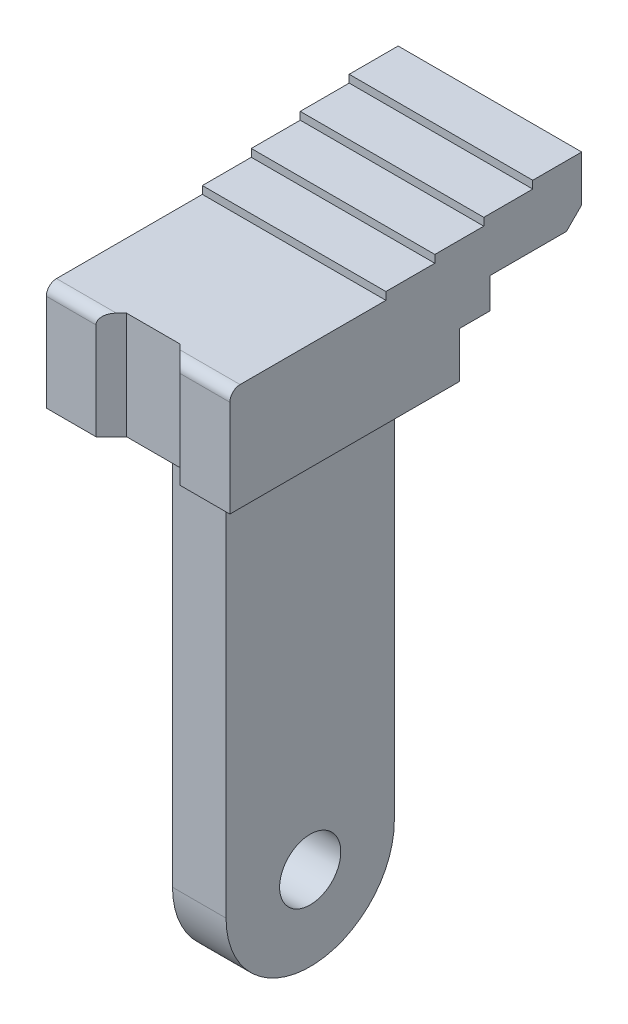
ISO-10303-21;
HEADER;
FILE_DESCRIPTION(('STEP AP214'),'2;1');
FILE_NAME('part.step','',(''),(''),'','','');
FILE_SCHEMA(('AUTOMOTIVE_DESIGN { 1 0 10303 214 1 1 1 1 }'));
ENDSEC;
DATA;
#1=APPLICATION_CONTEXT('core data for automotive mechanical design processes');
#2=APPLICATION_PROTOCOL_DEFINITION('international standard','automotive_design',2000,#1);
#3=PRODUCT_CONTEXT('',#1,'mechanical');
#4=PRODUCT('Part','Part','',(#3));
#5=PRODUCT_RELATED_PRODUCT_CATEGORY('part','',(#4));
#6=PRODUCT_DEFINITION_FORMATION('','',#4);
#7=PRODUCT_DEFINITION_CONTEXT('part definition',#1,'design');
#8=PRODUCT_DEFINITION('design','',#6,#7);
#9=PRODUCT_DEFINITION_SHAPE('','',#8);
#10=(LENGTH_UNIT() NAMED_UNIT(*) SI_UNIT(.MILLI.,.METRE.));
#11=(NAMED_UNIT(*) PLANE_ANGLE_UNIT() SI_UNIT($,.RADIAN.));
#12=(NAMED_UNIT(*) SI_UNIT($,.STERADIAN.) SOLID_ANGLE_UNIT());
#13=UNCERTAINTY_MEASURE_WITH_UNIT(LENGTH_MEASURE(1.E-05),#10,'distance_accuracy_value','');
#14=(GEOMETRIC_REPRESENTATION_CONTEXT(3) GLOBAL_UNCERTAINTY_ASSIGNED_CONTEXT((#13)) GLOBAL_UNIT_ASSIGNED_CONTEXT((#10,
#11,#12)) REPRESENTATION_CONTEXT('',''));
#15=CARTESIAN_POINT('',(0.,0.,0.));
#16=DIRECTION('',(0.,0.,1.));
#17=DIRECTION('',(1.,0.,0.));
#18=AXIS2_PLACEMENT_3D('',#15,#16,#17);
#19=CARTESIAN_POINT('',(3.,13.5,4.75));
#20=DIRECTION('',(0.,0.,-1.));
#21=DIRECTION('',(-1.,0.,0.));
#22=AXIS2_PLACEMENT_3D('',#19,#20,#21);
#23=PLANE('',#22);
#24=DIRECTION('',(0.,1.,0.));
#25=VECTOR('',#24,1.);
#26=CARTESIAN_POINT('',(-1.375,10.7049150281253,4.74999999999998));
#27=LINE('',#26,#25);
#28=CARTESIAN_POINT('',(-1.375,13.5,4.74999999999999));
#29=VERTEX_POINT('',#28);
#30=CARTESIAN_POINT('',(-1.375,16.6666666666667,4.74999999999999));
#31=VERTEX_POINT('',#30);
#32=EDGE_CURVE('E234',#29,#31,#27,.T.);
#33=ORIENTED_EDGE('',*,*,#32,.T.);
#34=DIRECTION('',(-1.,0.,0.));
#35=VECTOR('',#34,1.);
#36=CARTESIAN_POINT('',(3.,16.6666666666667,4.75));
#37=LINE('',#36,#35);
#38=CARTESIAN_POINT('',(-3.,16.6666666666667,4.75));
#39=VERTEX_POINT('',#38);
#40=EDGE_CURVE('E397',#31,#39,#37,.T.);
#41=ORIENTED_EDGE('',*,*,#40,.T.);
#42=DIRECTION('',(0.,-1.,0.));
#43=VECTOR('',#42,1.);
#44=CARTESIAN_POINT('',(-3.,13.5,4.75));
#45=LINE('',#44,#43);
#46=CARTESIAN_POINT('',(-3.,13.5,4.75));
#47=VERTEX_POINT('',#46);
#48=EDGE_CURVE('E340',#39,#47,#45,.T.);
#49=ORIENTED_EDGE('',*,*,#48,.T.);
#50=DIRECTION('',(-1.,0.,0.));
#51=VECTOR('',#50,1.);
#52=CARTESIAN_POINT('',(3.,13.5,4.75));
#53=LINE('',#52,#51);
#54=EDGE_CURVE('E348',#29,#47,#53,.T.);
#55=ORIENTED_EDGE('',*,*,#54,.F.);
#56=EDGE_LOOP('',(#33,#41,#49,#55));
#57=FACE_BOUND('',#56,.T.);
#58=ADVANCED_FACE('F32',(#57),#23,.F.);
#59=CARTESIAN_POINT('',(3.,0.,0.));
#60=DIRECTION('',(1.,0.,0.));
#61=DIRECTION('',(0.,0.,-1.));
#62=AXIS2_PLACEMENT_3D('',#59,#60,#61);
#63=PLANE('',#62);
#64=DIRECTION('',(0.,0.,1.));
#65=VECTOR('',#64,1.);
#66=CARTESIAN_POINT('',(3.,17.,4.75));
#67=LINE('',#66,#65);
#68=CARTESIAN_POINT('',(3.,17.,-0.349999999999995));
#69=VERTEX_POINT('',#68);
#70=CARTESIAN_POINT('',(3.,17.,4.41666666666667));
#71=VERTEX_POINT('',#70);
#72=EDGE_CURVE('E304',#69,#71,#67,.T.);
#73=ORIENTED_EDGE('',*,*,#72,.T.);
#74=CARTESIAN_POINT('',(3.,16.6666666666667,4.41666666666667));
#75=DIRECTION('',(1.,0.,0.));
#76=DIRECTION('',(0.,0.,-1.));
#77=AXIS2_PLACEMENT_3D('',#74,#75,#76);
#78=CIRCLE('',#77,0.333333333333333);
#79=CARTESIAN_POINT('',(3.,16.6666666666667,4.75));
#80=VERTEX_POINT('',#79);
#81=EDGE_CURVE('E11',#71,#80,#78,.T.);
#82=ORIENTED_EDGE('',*,*,#81,.T.);
#83=DIRECTION('',(0.,-1.,0.));
#84=VECTOR('',#83,1.);
#85=CARTESIAN_POINT('',(3.,13.5,4.75));
#86=LINE('',#85,#84);
#87=CARTESIAN_POINT('',(3.,13.5,4.75));
#88=VERTEX_POINT('',#87);
#89=EDGE_CURVE('E306',#80,#88,#86,.T.);
#90=ORIENTED_EDGE('',*,*,#89,.T.);
#91=DIRECTION('',(0.,0.,-1.));
#92=VECTOR('',#91,1.);
#93=CARTESIAN_POINT('',(3.,13.5,2.75));
#94=LINE('',#93,#92);
#95=CARTESIAN_POINT('',(3.,13.5,-2.75));
#96=VERTEX_POINT('',#95);
#97=EDGE_CURVE('E308',#88,#96,#94,.T.);
#98=ORIENTED_EDGE('',*,*,#97,.T.);
#99=DIRECTION('',(0.,1.,0.));
#100=VECTOR('',#99,1.);
#101=CARTESIAN_POINT('',(3.,0.,-2.75));
#102=LINE('',#101,#100);
#103=CARTESIAN_POINT('',(3.,15.,-2.75));
#104=VERTEX_POINT('',#103);
#105=EDGE_CURVE('E275',#96,#104,#102,.T.);
#106=ORIENTED_EDGE('',*,*,#105,.T.);
#107=DIRECTION('',(0.,0.,-1.));
#108=VECTOR('',#107,1.);
#109=CARTESIAN_POINT('',(3.,15.,-2.75));
#110=LINE('',#109,#108);
#111=CARTESIAN_POINT('',(3.,15.,-3.75));
#112=VERTEX_POINT('',#111);
#113=EDGE_CURVE('E277',#104,#112,#110,.T.);
#114=ORIENTED_EDGE('',*,*,#113,.T.);
#115=DIRECTION('',(0.,1.,0.));
#116=VECTOR('',#115,1.);
#117=CARTESIAN_POINT('',(3.,15.,-3.75));
#118=LINE('',#117,#116);
#119=CARTESIAN_POINT('',(3.,16.,-3.75));
#120=VERTEX_POINT('',#119);
#121=EDGE_CURVE('E280',#112,#120,#118,.T.);
#122=ORIENTED_EDGE('',*,*,#121,.T.);
#123=DIRECTION('',(0.,0.,-1.));
#124=VECTOR('',#123,1.);
#125=CARTESIAN_POINT('',(3.,16.,-3.75));
#126=LINE('',#125,#124);
#127=CARTESIAN_POINT('',(3.,16.,-6.25000000000001));
#128=VERTEX_POINT('',#127);
#129=EDGE_CURVE('E282',#120,#128,#126,.T.);
#130=ORIENTED_EDGE('',*,*,#129,.T.);
#131=DIRECTION('',(0.,0.707106781186547,-0.707106781186547));
#132=VECTOR('',#131,1.);
#133=CARTESIAN_POINT('',(3.,16.5,-6.75000000000001));
#134=LINE('',#133,#132);
#135=CARTESIAN_POINT('',(3.,16.5,-6.75000000000001));
#136=VERTEX_POINT('',#135);
#137=EDGE_CURVE('E284',#128,#136,#134,.T.);
#138=ORIENTED_EDGE('',*,*,#137,.T.);
#139=DIRECTION('',(0.,1.,0.));
#140=VECTOR('',#139,1.);
#141=CARTESIAN_POINT('',(3.,16.5,-6.75000000000001));
#142=LINE('',#141,#140);
#143=CARTESIAN_POINT('',(3.,18.,-6.75000000000001));
#144=VERTEX_POINT('',#143);
#145=EDGE_CURVE('E286',#136,#144,#142,.T.);
#146=ORIENTED_EDGE('',*,*,#145,.T.);
#147=DIRECTION('',(0.,0.,1.));
#148=VECTOR('',#147,1.);
#149=CARTESIAN_POINT('',(3.,18.,-6.75000000000001));
#150=LINE('',#149,#148);
#151=CARTESIAN_POINT('',(3.,18.,-5.15));
#152=VERTEX_POINT('',#151);
#153=EDGE_CURVE('E288',#144,#152,#150,.T.);
#154=ORIENTED_EDGE('',*,*,#153,.T.);
#155=DIRECTION('',(0.,-1.,0.));
#156=VECTOR('',#155,1.);
#157=CARTESIAN_POINT('',(3.,18.,-5.15));
#158=LINE('',#157,#156);
#159=CARTESIAN_POINT('',(3.,17.75,-5.15));
#160=VERTEX_POINT('',#159);
#161=EDGE_CURVE('E290',#152,#160,#158,.T.);
#162=ORIENTED_EDGE('',*,*,#161,.T.);
#163=DIRECTION('',(0.,0.,1.));
#164=VECTOR('',#163,1.);
#165=CARTESIAN_POINT('',(3.,17.75,-5.15));
#166=LINE('',#165,#164);
#167=CARTESIAN_POINT('',(3.,17.75,-3.55));
#168=VERTEX_POINT('',#167);
#169=EDGE_CURVE('E292',#160,#168,#166,.T.);
#170=ORIENTED_EDGE('',*,*,#169,.T.);
#171=DIRECTION('',(0.,-1.,0.));
#172=VECTOR('',#171,1.);
#173=CARTESIAN_POINT('',(3.,17.75,-3.55));
#174=LINE('',#173,#172);
#175=CARTESIAN_POINT('',(3.,17.5,-3.55));
#176=VERTEX_POINT('',#175);
#177=EDGE_CURVE('E294',#168,#176,#174,.T.);
#178=ORIENTED_EDGE('',*,*,#177,.T.);
#179=DIRECTION('',(0.,0.,1.));
#180=VECTOR('',#179,1.);
#181=CARTESIAN_POINT('',(3.,17.5,-1.95));
#182=LINE('',#181,#180);
#183=CARTESIAN_POINT('',(3.,17.5,-1.95));
#184=VERTEX_POINT('',#183);
#185=EDGE_CURVE('E296',#176,#184,#182,.T.);
#186=ORIENTED_EDGE('',*,*,#185,.T.);
#187=DIRECTION('',(0.,-1.,0.));
#188=VECTOR('',#187,1.);
#189=CARTESIAN_POINT('',(3.,17.5,-1.95));
#190=LINE('',#189,#188);
#191=CARTESIAN_POINT('',(3.,17.25,-1.95));
#192=VERTEX_POINT('',#191);
#193=EDGE_CURVE('E298',#184,#192,#190,.T.);
#194=ORIENTED_EDGE('',*,*,#193,.T.);
#195=DIRECTION('',(0.,0.,1.));
#196=VECTOR('',#195,1.);
#197=CARTESIAN_POINT('',(3.,17.25,-0.349999999999995));
#198=LINE('',#197,#196);
#199=CARTESIAN_POINT('',(3.,17.25,-0.349999999999995));
#200=VERTEX_POINT('',#199);
#201=EDGE_CURVE('E300',#192,#200,#198,.T.);
#202=ORIENTED_EDGE('',*,*,#201,.T.);
#203=DIRECTION('',(0.,-1.,0.));
#204=VECTOR('',#203,1.);
#205=CARTESIAN_POINT('',(3.,17.25,-0.349999999999995));
#206=LINE('',#205,#204);
#207=EDGE_CURVE('E302',#200,#69,#206,.T.);
#208=ORIENTED_EDGE('',*,*,#207,.T.);
#209=EDGE_LOOP('',(#73,#82,#90,#98,#106,#114,#122,#130,#138,#146,#154,#162,#170,#178,#186,#194,
#202,#208));
#210=FACE_BOUND('',#209,.T.);
#211=ADVANCED_FACE('F460',(#210),#63,.T.);
#212=CARTESIAN_POINT('',(-3.,0.,0.));
#213=DIRECTION('',(1.,0.,0.));
#214=DIRECTION('',(0.,0.,-1.));
#215=AXIS2_PLACEMENT_3D('',#212,#213,#214);
#216=PLANE('',#215);
#217=ORIENTED_EDGE('',*,*,#48,.F.);
#218=CARTESIAN_POINT('',(-3.,16.6666666666667,4.41666666666667));
#219=DIRECTION('',(1.,0.,0.));
#220=DIRECTION('',(0.,0.,-1.));
#221=AXIS2_PLACEMENT_3D('',#218,#219,#220);
#222=CIRCLE('',#221,0.333333333333333);
#223=CARTESIAN_POINT('',(-3.,17.,4.41666666666667));
#224=VERTEX_POINT('',#223);
#225=EDGE_CURVE('E404',#39,#224,#222,.F.);
#226=ORIENTED_EDGE('',*,*,#225,.T.);
#227=DIRECTION('',(0.,0.,1.));
#228=VECTOR('',#227,1.);
#229=CARTESIAN_POINT('',(-3.,17.,4.75));
#230=LINE('',#229,#228);
#231=CARTESIAN_POINT('',(-3.,17.,-0.349999999999995));
#232=VERTEX_POINT('',#231);
#233=EDGE_CURVE('E338',#232,#224,#230,.T.);
#234=ORIENTED_EDGE('',*,*,#233,.F.);
#235=DIRECTION('',(0.,-1.,0.));
#236=VECTOR('',#235,1.);
#237=CARTESIAN_POINT('',(-3.,17.25,-0.349999999999995));
#238=LINE('',#237,#236);
#239=CARTESIAN_POINT('',(-3.,17.25,-0.349999999999995));
#240=VERTEX_POINT('',#239);
#241=EDGE_CURVE('E336',#240,#232,#238,.T.);
#242=ORIENTED_EDGE('',*,*,#241,.F.);
#243=DIRECTION('',(0.,0.,1.));
#244=VECTOR('',#243,1.);
#245=CARTESIAN_POINT('',(-3.,17.25,-0.349999999999995));
#246=LINE('',#245,#244);
#247=CARTESIAN_POINT('',(-3.,17.25,-1.95));
#248=VERTEX_POINT('',#247);
#249=EDGE_CURVE('E334',#248,#240,#246,.T.);
#250=ORIENTED_EDGE('',*,*,#249,.F.);
#251=DIRECTION('',(0.,-1.,0.));
#252=VECTOR('',#251,1.);
#253=CARTESIAN_POINT('',(-3.,17.5,-1.95));
#254=LINE('',#253,#252);
#255=CARTESIAN_POINT('',(-3.,17.5,-1.95));
#256=VERTEX_POINT('',#255);
#257=EDGE_CURVE('E332',#256,#248,#254,.T.);
#258=ORIENTED_EDGE('',*,*,#257,.F.);
#259=DIRECTION('',(0.,0.,1.));
#260=VECTOR('',#259,1.);
#261=CARTESIAN_POINT('',(-3.,17.5,-1.95));
#262=LINE('',#261,#260);
#263=CARTESIAN_POINT('',(-3.,17.5,-3.55));
#264=VERTEX_POINT('',#263);
#265=EDGE_CURVE('E330',#264,#256,#262,.T.);
#266=ORIENTED_EDGE('',*,*,#265,.F.);
#267=DIRECTION('',(0.,-1.,0.));
#268=VECTOR('',#267,1.);
#269=CARTESIAN_POINT('',(-3.,17.75,-3.55));
#270=LINE('',#269,#268);
#271=CARTESIAN_POINT('',(-3.,17.75,-3.55));
#272=VERTEX_POINT('',#271);
#273=EDGE_CURVE('E328',#272,#264,#270,.T.);
#274=ORIENTED_EDGE('',*,*,#273,.F.);
#275=DIRECTION('',(0.,0.,1.));
#276=VECTOR('',#275,1.);
#277=CARTESIAN_POINT('',(-3.,17.75,-5.15));
#278=LINE('',#277,#276);
#279=CARTESIAN_POINT('',(-3.,17.75,-5.15));
#280=VERTEX_POINT('',#279);
#281=EDGE_CURVE('E326',#280,#272,#278,.T.);
#282=ORIENTED_EDGE('',*,*,#281,.F.);
#283=DIRECTION('',(0.,-1.,0.));
#284=VECTOR('',#283,1.);
#285=CARTESIAN_POINT('',(-3.,18.,-5.15));
#286=LINE('',#285,#284);
#287=CARTESIAN_POINT('',(-3.,18.,-5.15));
#288=VERTEX_POINT('',#287);
#289=EDGE_CURVE('E324',#288,#280,#286,.T.);
#290=ORIENTED_EDGE('',*,*,#289,.F.);
#291=DIRECTION('',(0.,0.,1.));
#292=VECTOR('',#291,1.);
#293=CARTESIAN_POINT('',(-3.,18.,-6.75000000000001));
#294=LINE('',#293,#292);
#295=CARTESIAN_POINT('',(-3.,18.,-6.75000000000001));
#296=VERTEX_POINT('',#295);
#297=EDGE_CURVE('E322',#296,#288,#294,.T.);
#298=ORIENTED_EDGE('',*,*,#297,.F.);
#299=DIRECTION('',(0.,1.,0.));
#300=VECTOR('',#299,1.);
#301=CARTESIAN_POINT('',(-3.,16.5,-6.75000000000001));
#302=LINE('',#301,#300);
#303=CARTESIAN_POINT('',(-3.,16.5,-6.75000000000001));
#304=VERTEX_POINT('',#303);
#305=EDGE_CURVE('E320',#304,#296,#302,.T.);
#306=ORIENTED_EDGE('',*,*,#305,.F.);
#307=DIRECTION('',(0.,0.707106781186547,-0.707106781186547));
#308=VECTOR('',#307,1.);
#309=CARTESIAN_POINT('',(-3.,16.5,-6.75000000000001));
#310=LINE('',#309,#308);
#311=CARTESIAN_POINT('',(-3.,16.,-6.25000000000001));
#312=VERTEX_POINT('',#311);
#313=EDGE_CURVE('E318',#312,#304,#310,.T.);
#314=ORIENTED_EDGE('',*,*,#313,.F.);
#315=DIRECTION('',(0.,0.,-1.));
#316=VECTOR('',#315,1.);
#317=CARTESIAN_POINT('',(-3.,16.,-3.75));
#318=LINE('',#317,#316);
#319=CARTESIAN_POINT('',(-3.,16.,-3.75));
#320=VERTEX_POINT('',#319);
#321=EDGE_CURVE('E316',#320,#312,#318,.T.);
#322=ORIENTED_EDGE('',*,*,#321,.F.);
#323=DIRECTION('',(0.,1.,0.));
#324=VECTOR('',#323,1.);
#325=CARTESIAN_POINT('',(-3.,15.,-3.75));
#326=LINE('',#325,#324);
#327=CARTESIAN_POINT('',(-3.,15.,-3.75));
#328=VERTEX_POINT('',#327);
#329=EDGE_CURVE('E314',#328,#320,#326,.T.);
#330=ORIENTED_EDGE('',*,*,#329,.F.);
#331=DIRECTION('',(0.,0.,-1.));
#332=VECTOR('',#331,1.);
#333=CARTESIAN_POINT('',(-3.,15.,-2.75));
#334=LINE('',#333,#332);
#335=CARTESIAN_POINT('',(-3.,15.,-2.75));
#336=VERTEX_POINT('',#335);
#337=EDGE_CURVE('E312',#336,#328,#334,.T.);
#338=ORIENTED_EDGE('',*,*,#337,.F.);
#339=DIRECTION('',(0.,1.,0.));
#340=VECTOR('',#339,1.);
#341=CARTESIAN_POINT('',(-3.,0.,-2.75));
#342=LINE('',#341,#340);
#343=CARTESIAN_POINT('',(-3.,13.5,-2.75));
#344=VERTEX_POINT('',#343);
#345=EDGE_CURVE('E274',#344,#336,#342,.T.);
#346=ORIENTED_EDGE('',*,*,#345,.F.);
#347=DIRECTION('',(0.,0.,-1.));
#348=VECTOR('',#347,1.);
#349=CARTESIAN_POINT('',(-3.,13.5,2.75));
#350=LINE('',#349,#348);
#351=EDGE_CURVE('E278',#47,#344,#350,.T.);
#352=ORIENTED_EDGE('',*,*,#351,.F.);
#353=EDGE_LOOP('',(#217,#226,#234,#242,#250,#258,#266,#274,#282,#290,#298,#306,#314,#322,#330,
#338,#346,#352));
#354=FACE_BOUND('',#353,.T.);
#355=ADVANCED_FACE('F434',(#354),#216,.F.);
#356=CARTESIAN_POINT('',(3.,0.,0.));
#357=DIRECTION('',(-1.,0.,0.));
#358=DIRECTION('',(0.,0.,1.));
#359=AXIS2_PLACEMENT_3D('',#356,#357,#358);
#360=CYLINDRICAL_SURFACE('',#359,2.75);
#361=CARTESIAN_POINT('',(0.875,0.,0.));
#362=DIRECTION('',(-1.,0.,0.));
#363=DIRECTION('',(0.,0.,1.));
#364=AXIS2_PLACEMENT_3D('',#361,#362,#363);
#365=CIRCLE('',#364,2.75);
#366=CARTESIAN_POINT('',(0.875,0.,-2.75));
#367=VERTEX_POINT('',#366);
#368=CARTESIAN_POINT('',(0.875,0.,2.75));
#369=VERTEX_POINT('',#368);
#370=EDGE_CURVE('E263',#367,#369,#365,.T.);
#371=ORIENTED_EDGE('',*,*,#370,.T.);
#372=DIRECTION('',(-1.,0.,0.));
#373=VECTOR('',#372,1.);
#374=CARTESIAN_POINT('',(3.,0.,2.75));
#375=LINE('',#374,#373);
#376=CARTESIAN_POINT('',(-0.875,0.,2.75));
#377=VERTEX_POINT('',#376);
#378=EDGE_CURVE('E310',#369,#377,#375,.T.);
#379=ORIENTED_EDGE('',*,*,#378,.T.);
#380=CARTESIAN_POINT('',(-0.875,0.,0.));
#381=DIRECTION('',(1.,0.,0.));
#382=DIRECTION('',(0.,0.,-1.));
#383=AXIS2_PLACEMENT_3D('',#380,#381,#382);
#384=CIRCLE('',#383,2.75);
#385=CARTESIAN_POINT('',(-0.875,0.,-2.75));
#386=VERTEX_POINT('',#385);
#387=EDGE_CURVE('E253',#377,#386,#384,.T.);
#388=ORIENTED_EDGE('',*,*,#387,.T.);
#389=DIRECTION('',(-1.,0.,0.));
#390=VECTOR('',#389,1.);
#391=CARTESIAN_POINT('',(3.,0.,-2.75));
#392=LINE('',#391,#390);
#393=EDGE_CURVE('E394',#367,#386,#392,.T.);
#394=ORIENTED_EDGE('',*,*,#393,.F.);
#395=EDGE_LOOP('',(#371,#379,#388,#394));
#396=FACE_BOUND('',#395,.T.);
#397=ADVANCED_FACE('F448',(#396),#360,.T.);
#398=CARTESIAN_POINT('',(3.,0.,-2.75));
#399=DIRECTION('',(0.,0.,1.));
#400=DIRECTION('',(1.,0.,0.));
#401=AXIS2_PLACEMENT_3D('',#398,#399,#400);
#402=PLANE('',#401);
#403=DIRECTION('',(-1.,0.,0.));
#404=VECTOR('',#403,1.);
#405=CARTESIAN_POINT('',(3.,13.5,-2.75));
#406=LINE('',#405,#404);
#407=CARTESIAN_POINT('',(0.875,13.5,-2.75));
#408=VERTEX_POINT('',#407);
#409=EDGE_CURVE('E271',#96,#408,#406,.T.);
#410=ORIENTED_EDGE('',*,*,#409,.T.);
#411=DIRECTION('',(0.,-1.,0.));
#412=VECTOR('',#411,1.);
#413=CARTESIAN_POINT('',(0.875,0.,-2.75));
#414=LINE('',#413,#412);
#415=EDGE_CURVE('E265',#408,#367,#414,.T.);
#416=ORIENTED_EDGE('',*,*,#415,.T.);
#417=ORIENTED_EDGE('',*,*,#393,.T.);
#418=DIRECTION('',(0.,1.,0.));
#419=VECTOR('',#418,1.);
#420=CARTESIAN_POINT('',(-0.875,0.,-2.75));
#421=LINE('',#420,#419);
#422=CARTESIAN_POINT('',(-0.875,13.5,-2.75));
#423=VERTEX_POINT('',#422);
#424=EDGE_CURVE('E256',#386,#423,#421,.T.);
#425=ORIENTED_EDGE('',*,*,#424,.T.);
#426=DIRECTION('',(-1.,0.,0.));
#427=VECTOR('',#426,1.);
#428=CARTESIAN_POINT('',(3.,13.5,-2.75));
#429=LINE('',#428,#427);
#430=EDGE_CURVE('E268',#423,#344,#429,.T.);
#431=ORIENTED_EDGE('',*,*,#430,.T.);
#432=ORIENTED_EDGE('',*,*,#345,.T.);
#433=DIRECTION('',(-1.,0.,0.));
#434=VECTOR('',#433,1.);
#435=CARTESIAN_POINT('',(3.,15.,-2.75));
#436=LINE('',#435,#434);
#437=EDGE_CURVE('E391',#104,#336,#436,.T.);
#438=ORIENTED_EDGE('',*,*,#437,.F.);
#439=ORIENTED_EDGE('',*,*,#105,.F.);
#440=EDGE_LOOP('',(#410,#416,#417,#425,#431,#432,#438,#439));
#441=FACE_BOUND('',#440,.T.);
#442=ADVANCED_FACE('F442',(#441),#402,.F.);
#443=CARTESIAN_POINT('',(3.,15.,-2.75));
#444=DIRECTION('',(0.,1.,0.));
#445=DIRECTION('',(0.,0.,1.));
#446=AXIS2_PLACEMENT_3D('',#443,#444,#445);
#447=PLANE('',#446);
#448=ORIENTED_EDGE('',*,*,#337,.T.);
#449=DIRECTION('',(-1.,0.,0.));
#450=VECTOR('',#449,1.);
#451=CARTESIAN_POINT('',(3.,15.,-3.75));
#452=LINE('',#451,#450);
#453=EDGE_CURVE('E388',#112,#328,#452,.T.);
#454=ORIENTED_EDGE('',*,*,#453,.F.);
#455=ORIENTED_EDGE('',*,*,#113,.F.);
#456=ORIENTED_EDGE('',*,*,#437,.T.);
#457=EDGE_LOOP('',(#448,#454,#455,#456));
#458=FACE_BOUND('',#457,.T.);
#459=ADVANCED_FACE('F465',(#458),#447,.F.);
#460=CARTESIAN_POINT('',(3.,15.,-3.75));
#461=DIRECTION('',(0.,0.,1.));
#462=DIRECTION('',(1.,0.,0.));
#463=AXIS2_PLACEMENT_3D('',#460,#461,#462);
#464=PLANE('',#463);
#465=ORIENTED_EDGE('',*,*,#329,.T.);
#466=DIRECTION('',(-1.,0.,0.));
#467=VECTOR('',#466,1.);
#468=CARTESIAN_POINT('',(3.,16.,-3.75));
#469=LINE('',#468,#467);
#470=EDGE_CURVE('E385',#120,#320,#469,.T.);
#471=ORIENTED_EDGE('',*,*,#470,.F.);
#472=ORIENTED_EDGE('',*,*,#121,.F.);
#473=ORIENTED_EDGE('',*,*,#453,.T.);
#474=EDGE_LOOP('',(#465,#471,#472,#473));
#475=FACE_BOUND('',#474,.T.);
#476=ADVANCED_FACE('F468',(#475),#464,.F.);
#477=CARTESIAN_POINT('',(3.,16.,-3.75));
#478=DIRECTION('',(0.,1.,0.));
#479=DIRECTION('',(0.,0.,1.));
#480=AXIS2_PLACEMENT_3D('',#477,#478,#479);
#481=PLANE('',#480);
#482=ORIENTED_EDGE('',*,*,#321,.T.);
#483=DIRECTION('',(-1.,0.,0.));
#484=VECTOR('',#483,1.);
#485=CARTESIAN_POINT('',(3.,16.,-6.25000000000001));
#486=LINE('',#485,#484);
#487=EDGE_CURVE('E382',#128,#312,#486,.T.);
#488=ORIENTED_EDGE('',*,*,#487,.F.);
#489=ORIENTED_EDGE('',*,*,#129,.F.);
#490=ORIENTED_EDGE('',*,*,#470,.T.);
#491=EDGE_LOOP('',(#482,#488,#489,#490));
#492=FACE_BOUND('',#491,.T.);
#493=ADVANCED_FACE('F473',(#492),#481,.F.);
#494=CARTESIAN_POINT('',(3.,16.5,-6.75000000000001));
#495=DIRECTION('',(0.,0.707106781186548,0.707106781186548));
#496=DIRECTION('',(0.,-0.707106781186548,0.707106781186548));
#497=AXIS2_PLACEMENT_3D('',#494,#495,#496);
#498=PLANE('',#497);
#499=ORIENTED_EDGE('',*,*,#313,.T.);
#500=DIRECTION('',(-1.,0.,0.));
#501=VECTOR('',#500,1.);
#502=CARTESIAN_POINT('',(3.,16.5,-6.75000000000001));
#503=LINE('',#502,#501);
#504=EDGE_CURVE('E379',#136,#304,#503,.T.);
#505=ORIENTED_EDGE('',*,*,#504,.F.);
#506=ORIENTED_EDGE('',*,*,#137,.F.);
#507=ORIENTED_EDGE('',*,*,#487,.T.);
#508=EDGE_LOOP('',(#499,#505,#506,#507));
#509=FACE_BOUND('',#508,.T.);
#510=ADVANCED_FACE('F479',(#509),#498,.F.);
#511=CARTESIAN_POINT('',(3.,16.5,-6.75000000000001));
#512=DIRECTION('',(0.,0.,1.));
#513=DIRECTION('',(1.,0.,0.));
#514=AXIS2_PLACEMENT_3D('',#511,#512,#513);
#515=PLANE('',#514);
#516=ORIENTED_EDGE('',*,*,#305,.T.);
#517=DIRECTION('',(-1.,0.,0.));
#518=VECTOR('',#517,1.);
#519=CARTESIAN_POINT('',(3.,18.,-6.75000000000001));
#520=LINE('',#519,#518);
#521=EDGE_CURVE('E376',#144,#296,#520,.T.);
#522=ORIENTED_EDGE('',*,*,#521,.F.);
#523=ORIENTED_EDGE('',*,*,#145,.F.);
#524=ORIENTED_EDGE('',*,*,#504,.T.);
#525=EDGE_LOOP('',(#516,#522,#523,#524));
#526=FACE_BOUND('',#525,.T.);
#527=ADVANCED_FACE('F483',(#526),#515,.F.);
#528=CARTESIAN_POINT('',(3.,18.,-6.75000000000001));
#529=DIRECTION('',(0.,-1.,0.));
#530=DIRECTION('',(0.,0.,-1.));
#531=AXIS2_PLACEMENT_3D('',#528,#529,#530);
#532=PLANE('',#531);
#533=ORIENTED_EDGE('',*,*,#297,.T.);
#534=DIRECTION('',(-1.,0.,0.));
#535=VECTOR('',#534,1.);
#536=CARTESIAN_POINT('',(3.,18.,-5.15));
#537=LINE('',#536,#535);
#538=EDGE_CURVE('E373',#152,#288,#537,.T.);
#539=ORIENTED_EDGE('',*,*,#538,.F.);
#540=ORIENTED_EDGE('',*,*,#153,.F.);
#541=ORIENTED_EDGE('',*,*,#521,.T.);
#542=EDGE_LOOP('',(#533,#539,#540,#541));
#543=FACE_BOUND('',#542,.T.);
#544=ADVANCED_FACE('F488',(#543),#532,.F.);
#545=CARTESIAN_POINT('',(3.,18.,-5.15));
#546=DIRECTION('',(0.,0.,-1.));
#547=DIRECTION('',(-1.,0.,0.));
#548=AXIS2_PLACEMENT_3D('',#545,#546,#547);
#549=PLANE('',#548);
#550=ORIENTED_EDGE('',*,*,#289,.T.);
#551=DIRECTION('',(-1.,0.,0.));
#552=VECTOR('',#551,1.);
#553=CARTESIAN_POINT('',(3.,17.75,-5.15));
#554=LINE('',#553,#552);
#555=EDGE_CURVE('E370',#160,#280,#554,.T.);
#556=ORIENTED_EDGE('',*,*,#555,.F.);
#557=ORIENTED_EDGE('',*,*,#161,.F.);
#558=ORIENTED_EDGE('',*,*,#538,.T.);
#559=EDGE_LOOP('',(#550,#556,#557,#558));
#560=FACE_BOUND('',#559,.T.);
#561=ADVANCED_FACE('F494',(#560),#549,.F.);
#562=CARTESIAN_POINT('',(3.,17.75,-5.15));
#563=DIRECTION('',(0.,-1.,0.));
#564=DIRECTION('',(0.,0.,-1.));
#565=AXIS2_PLACEMENT_3D('',#562,#563,#564);
#566=PLANE('',#565);
#567=ORIENTED_EDGE('',*,*,#281,.T.);
#568=DIRECTION('',(-1.,0.,0.));
#569=VECTOR('',#568,1.);
#570=CARTESIAN_POINT('',(3.,17.75,-3.55));
#571=LINE('',#570,#569);
#572=EDGE_CURVE('E367',#168,#272,#571,.T.);
#573=ORIENTED_EDGE('',*,*,#572,.F.);
#574=ORIENTED_EDGE('',*,*,#169,.F.);
#575=ORIENTED_EDGE('',*,*,#555,.T.);
#576=EDGE_LOOP('',(#567,#573,#574,#575));
#577=FACE_BOUND('',#576,.T.);
#578=ADVANCED_FACE('F498',(#577),#566,.F.);
#579=CARTESIAN_POINT('',(3.,17.75,-3.55));
#580=DIRECTION('',(0.,0.,-1.));
#581=DIRECTION('',(0.,1.,0.));
#582=AXIS2_PLACEMENT_3D('',#579,#580,#581);
#583=PLANE('',#582);
#584=ORIENTED_EDGE('',*,*,#273,.T.);
#585=DIRECTION('',(-1.,0.,0.));
#586=VECTOR('',#585,1.);
#587=CARTESIAN_POINT('',(3.,17.5,-3.55));
#588=LINE('',#587,#586);
#589=EDGE_CURVE('E364',#176,#264,#588,.T.);
#590=ORIENTED_EDGE('',*,*,#589,.F.);
#591=ORIENTED_EDGE('',*,*,#177,.F.);
#592=ORIENTED_EDGE('',*,*,#572,.T.);
#593=EDGE_LOOP('',(#584,#590,#591,#592));
#594=FACE_BOUND('',#593,.T.);
#595=ADVANCED_FACE('F503',(#594),#583,.F.);
#596=CARTESIAN_POINT('',(3.,17.5,-1.95));
#597=DIRECTION('',(0.,-1.,0.));
#598=DIRECTION('',(0.,0.,-1.));
#599=AXIS2_PLACEMENT_3D('',#596,#597,#598);
#600=PLANE('',#599);
#601=ORIENTED_EDGE('',*,*,#265,.T.);
#602=DIRECTION('',(-1.,0.,0.));
#603=VECTOR('',#602,1.);
#604=CARTESIAN_POINT('',(3.,17.5,-1.95));
#605=LINE('',#604,#603);
#606=EDGE_CURVE('E361',#184,#256,#605,.T.);
#607=ORIENTED_EDGE('',*,*,#606,.F.);
#608=ORIENTED_EDGE('',*,*,#185,.F.);
#609=ORIENTED_EDGE('',*,*,#589,.T.);
#610=EDGE_LOOP('',(#601,#607,#608,#609));
#611=FACE_BOUND('',#610,.T.);
#612=ADVANCED_FACE('F509',(#611),#600,.F.);
#613=CARTESIAN_POINT('',(3.,17.5,-1.95));
#614=DIRECTION('',(0.,0.,-1.));
#615=DIRECTION('',(0.,1.,0.));
#616=AXIS2_PLACEMENT_3D('',#613,#614,#615);
#617=PLANE('',#616);
#618=ORIENTED_EDGE('',*,*,#257,.T.);
#619=DIRECTION('',(-1.,0.,0.));
#620=VECTOR('',#619,1.);
#621=CARTESIAN_POINT('',(3.,17.25,-1.95));
#622=LINE('',#621,#620);
#623=EDGE_CURVE('E358',#192,#248,#622,.T.);
#624=ORIENTED_EDGE('',*,*,#623,.F.);
#625=ORIENTED_EDGE('',*,*,#193,.F.);
#626=ORIENTED_EDGE('',*,*,#606,.T.);
#627=EDGE_LOOP('',(#618,#624,#625,#626));
#628=FACE_BOUND('',#627,.T.);
#629=ADVANCED_FACE('F513',(#628),#617,.F.);
#630=CARTESIAN_POINT('',(3.,17.25,-0.349999999999995));
#631=DIRECTION('',(0.,-1.,0.));
#632=DIRECTION('',(0.,0.,-1.));
#633=AXIS2_PLACEMENT_3D('',#630,#631,#632);
#634=PLANE('',#633);
#635=ORIENTED_EDGE('',*,*,#249,.T.);
#636=DIRECTION('',(-1.,0.,0.));
#637=VECTOR('',#636,1.);
#638=CARTESIAN_POINT('',(3.,17.25,-0.349999999999995));
#639=LINE('',#638,#637);
#640=EDGE_CURVE('E355',#200,#240,#639,.T.);
#641=ORIENTED_EDGE('',*,*,#640,.F.);
#642=ORIENTED_EDGE('',*,*,#201,.F.);
#643=ORIENTED_EDGE('',*,*,#623,.T.);
#644=EDGE_LOOP('',(#635,#641,#642,#643));
#645=FACE_BOUND('',#644,.T.);
#646=ADVANCED_FACE('F518',(#645),#634,.F.);
#647=CARTESIAN_POINT('',(3.,17.25,-0.349999999999995));
#648=DIRECTION('',(0.,0.,-1.));
#649=DIRECTION('',(-1.,0.,0.));
#650=AXIS2_PLACEMENT_3D('',#647,#648,#649);
#651=PLANE('',#650);
#652=ORIENTED_EDGE('',*,*,#241,.T.);
#653=DIRECTION('',(-1.,0.,0.));
#654=VECTOR('',#653,1.);
#655=CARTESIAN_POINT('',(3.,17.,-0.349999999999995));
#656=LINE('',#655,#654);
#657=EDGE_CURVE('E352',#69,#232,#656,.T.);
#658=ORIENTED_EDGE('',*,*,#657,.F.);
#659=ORIENTED_EDGE('',*,*,#207,.F.);
#660=ORIENTED_EDGE('',*,*,#640,.T.);
#661=EDGE_LOOP('',(#652,#658,#659,#660));
#662=FACE_BOUND('',#661,.T.);
#663=ADVANCED_FACE('F523',(#662),#651,.F.);
#664=CARTESIAN_POINT('',(3.,17.,4.75));
#665=DIRECTION('',(0.,-1.,0.));
#666=DIRECTION('',(0.,0.,-1.));
#667=AXIS2_PLACEMENT_3D('',#664,#665,#666);
#668=PLANE('',#667);
#669=ORIENTED_EDGE('',*,*,#233,.T.);
#670=DIRECTION('',(-1.,0.,0.));
#671=VECTOR('',#670,1.);
#672=CARTESIAN_POINT('',(3.,17.,4.41666666666667));
#673=LINE('',#672,#671);
#674=CARTESIAN_POINT('',(-1.04166666666668,17.,4.41666666666667));
#675=VERTEX_POINT('',#674);
#676=EDGE_CURVE('E408',#224,#675,#673,.F.);
#677=ORIENTED_EDGE('',*,*,#676,.T.);
#678=DIRECTION('',(-0.707106781186547,0.,0.707106781186548));
#679=VECTOR('',#678,1.);
#680=CARTESIAN_POINT('',(-0.875,17.,4.24999999999999));
#681=LINE('',#680,#679);
#682=CARTESIAN_POINT('',(-0.875,17.,4.24999999999999));
#683=VERTEX_POINT('',#682);
#684=EDGE_CURVE('E218',#683,#675,#681,.T.);
#685=ORIENTED_EDGE('',*,*,#684,.F.);
#686=DIRECTION('',(-1.,0.,0.));
#687=VECTOR('',#686,1.);
#688=CARTESIAN_POINT('',(-0.875,17.,4.24999999999999));
#689=LINE('',#688,#687);
#690=CARTESIAN_POINT('',(0.875,17.,4.24999999999999));
#691=VERTEX_POINT('',#690);
#692=EDGE_CURVE('E217',#691,#683,#689,.T.);
#693=ORIENTED_EDGE('',*,*,#692,.F.);
#694=DIRECTION('',(-0.707106781186547,0.,-0.707106781186548));
#695=VECTOR('',#694,1.);
#696=CARTESIAN_POINT('',(0.875,17.,4.24999999999999));
#697=LINE('',#696,#695);
#698=CARTESIAN_POINT('',(1.04166666666668,17.,4.41666666666667));
#699=VERTEX_POINT('',#698);
#700=EDGE_CURVE('E209',#699,#691,#697,.T.);
#701=ORIENTED_EDGE('',*,*,#700,.F.);
#702=DIRECTION('',(-1.,0.,0.));
#703=VECTOR('',#702,1.);
#704=CARTESIAN_POINT('',(3.,17.,4.41666666666667));
#705=LINE('',#704,#703);
#706=EDGE_CURVE('E406',#699,#71,#705,.F.);
#707=ORIENTED_EDGE('',*,*,#706,.T.);
#708=ORIENTED_EDGE('',*,*,#72,.F.);
#709=ORIENTED_EDGE('',*,*,#657,.T.);
#710=EDGE_LOOP('',(#669,#677,#685,#693,#701,#707,#708,#709));
#711=FACE_BOUND('',#710,.T.);
#712=ADVANCED_FACE('F232',(#711),#668,.F.);
#713=ORIENTED_EDGE('',*,*,#89,.F.);
#714=DIRECTION('',(-1.,0.,0.));
#715=VECTOR('',#714,1.);
#716=CARTESIAN_POINT('',(3.,16.6666666666667,4.75));
#717=LINE('',#716,#715);
#718=CARTESIAN_POINT('',(1.375,16.6666666666667,4.74999999999999));
#719=VERTEX_POINT('',#718);
#720=EDGE_CURVE('E412',#80,#719,#717,.T.);
#721=ORIENTED_EDGE('',*,*,#720,.T.);
#722=DIRECTION('',(0.,1.,0.));
#723=VECTOR('',#722,1.);
#724=CARTESIAN_POINT('',(1.375,10.7049150281253,4.74999999999998));
#725=LINE('',#724,#723);
#726=CARTESIAN_POINT('',(1.375,13.5,4.74999999999999));
#727=VERTEX_POINT('',#726);
#728=EDGE_CURVE('E229',#727,#719,#725,.T.);
#729=ORIENTED_EDGE('',*,*,#728,.F.);
#730=EDGE_CURVE('E349',#88,#727,#53,.T.);
#731=ORIENTED_EDGE('',*,*,#730,.F.);
#732=EDGE_LOOP('',(#713,#721,#729,#731));
#733=FACE_BOUND('',#732,.T.);
#734=ADVANCED_FACE('F415',(#733),#23,.F.);
#735=CARTESIAN_POINT('',(3.,13.5,2.75));
#736=DIRECTION('',(0.,1.,0.));
#737=DIRECTION('',(0.,0.,1.));
#738=AXIS2_PLACEMENT_3D('',#735,#736,#737);
#739=PLANE('',#738);
#740=DIRECTION('',(1.,0.,0.));
#741=VECTOR('',#740,1.);
#742=CARTESIAN_POINT('',(-0.875,13.5,4.24999999999999));
#743=LINE('',#742,#741);
#744=CARTESIAN_POINT('',(-0.875,13.5,4.24999999999999));
#745=VERTEX_POINT('',#744);
#746=CARTESIAN_POINT('',(0.875,13.5,4.24999999999999));
#747=VERTEX_POINT('',#746);
#748=EDGE_CURVE('E226',#745,#747,#743,.T.);
#749=ORIENTED_EDGE('',*,*,#748,.F.);
#750=DIRECTION('',(0.707106781186547,0.,-0.707106781186548));
#751=VECTOR('',#750,1.);
#752=CARTESIAN_POINT('',(-0.874999999999999,13.5,4.24999999999999));
#753=LINE('',#752,#751);
#754=EDGE_CURVE('E249',#29,#745,#753,.T.);
#755=ORIENTED_EDGE('',*,*,#754,.F.);
#756=ORIENTED_EDGE('',*,*,#54,.T.);
#757=ORIENTED_EDGE('',*,*,#351,.T.);
#758=ORIENTED_EDGE('',*,*,#430,.F.);
#759=DIRECTION('',(0.,0.,1.));
#760=VECTOR('',#759,1.);
#761=CARTESIAN_POINT('',(-0.875,13.5,-6.75000000000001));
#762=LINE('',#761,#760);
#763=CARTESIAN_POINT('',(-0.875,13.5,2.75));
#764=VERTEX_POINT('',#763);
#765=EDGE_CURVE('E246',#423,#764,#762,.T.);
#766=ORIENTED_EDGE('',*,*,#765,.T.);
#767=DIRECTION('',(-1.,0.,0.));
#768=VECTOR('',#767,1.);
#769=CARTESIAN_POINT('',(3.,13.5,2.75));
#770=LINE('',#769,#768);
#771=CARTESIAN_POINT('',(0.875,13.5,2.75));
#772=VERTEX_POINT('',#771);
#773=EDGE_CURVE('E345',#772,#764,#770,.T.);
#774=ORIENTED_EDGE('',*,*,#773,.F.);
#775=DIRECTION('',(0.,0.,1.));
#776=VECTOR('',#775,1.);
#777=CARTESIAN_POINT('',(0.875,13.5,-6.75000000000001));
#778=LINE('',#777,#776);
#779=EDGE_CURVE('E243',#408,#772,#778,.T.);
#780=ORIENTED_EDGE('',*,*,#779,.F.);
#781=ORIENTED_EDGE('',*,*,#409,.F.);
#782=ORIENTED_EDGE('',*,*,#97,.F.);
#783=ORIENTED_EDGE('',*,*,#730,.T.);
#784=DIRECTION('',(0.707106781186547,0.,0.707106781186548));
#785=VECTOR('',#784,1.);
#786=CARTESIAN_POINT('',(0.874999999999999,13.5,4.24999999999999));
#787=LINE('',#786,#785);
#788=EDGE_CURVE('E240',#747,#727,#787,.T.);
#789=ORIENTED_EDGE('',*,*,#788,.F.);
#790=EDGE_LOOP('',(#749,#755,#756,#757,#758,#766,#774,#780,#781,#782,#783,#789));
#791=FACE_BOUND('',#790,.T.);
#792=ADVANCED_FACE('F438',(#791),#739,.F.);
#793=CARTESIAN_POINT('',(3.,0.,2.75));
#794=DIRECTION('',(0.,0.,-1.));
#795=DIRECTION('',(-1.,0.,0.));
#796=AXIS2_PLACEMENT_3D('',#793,#794,#795);
#797=PLANE('',#796);
#798=ORIENTED_EDGE('',*,*,#378,.F.);
#799=DIRECTION('',(0.,1.,0.));
#800=VECTOR('',#799,1.);
#801=CARTESIAN_POINT('',(0.875,0.,2.75));
#802=LINE('',#801,#800);
#803=EDGE_CURVE('E260',#369,#772,#802,.T.);
#804=ORIENTED_EDGE('',*,*,#803,.T.);
#805=ORIENTED_EDGE('',*,*,#773,.T.);
#806=DIRECTION('',(0.,-1.,0.));
#807=VECTOR('',#806,1.);
#808=CARTESIAN_POINT('',(-0.875,0.,2.75));
#809=LINE('',#808,#807);
#810=EDGE_CURVE('E250',#764,#377,#809,.T.);
#811=ORIENTED_EDGE('',*,*,#810,.T.);
#812=EDGE_LOOP('',(#798,#804,#805,#811));
#813=FACE_BOUND('',#812,.T.);
#814=ADVANCED_FACE('F452',(#813),#797,.F.);
#815=CARTESIAN_POINT('',(-0.875,-2.75,-6.75000000000001));
#816=DIRECTION('',(1.,0.,0.));
#817=DIRECTION('',(0.,0.,-1.));
#818=AXIS2_PLACEMENT_3D('',#815,#816,#817);
#819=PLANE('',#818);
#820=CARTESIAN_POINT('',(-0.875,0.,0.));
#821=DIRECTION('',(1.,0.,0.));
#822=DIRECTION('',(0.,0.,-1.));
#823=AXIS2_PLACEMENT_3D('',#820,#821,#822);
#824=CIRCLE('',#823,1.);
#825=CARTESIAN_POINT('',(-0.875,0.,-1.));
#826=VERTEX_POINT('',#825);
#827=EDGE_CURVE('E245',#826,#826,#824,.T.);
#828=ORIENTED_EDGE('',*,*,#827,.T.);
#829=EDGE_LOOP('',(#828));
#830=FACE_BOUND('',#829,.T.);
#831=ORIENTED_EDGE('',*,*,#387,.F.);
#832=ORIENTED_EDGE('',*,*,#810,.F.);
#833=ORIENTED_EDGE('',*,*,#765,.F.);
#834=ORIENTED_EDGE('',*,*,#424,.F.);
#835=EDGE_LOOP('',(#831,#832,#833,#834));
#836=FACE_BOUND('',#835,.T.);
#837=ADVANCED_FACE('F446',(#830,#836),#819,.F.);
#838=CARTESIAN_POINT('',(0.875,-2.75,-6.75000000000001));
#839=DIRECTION('',(-1.,0.,0.));
#840=DIRECTION('',(0.,0.,1.));
#841=AXIS2_PLACEMENT_3D('',#838,#839,#840);
#842=PLANE('',#841);
#843=CARTESIAN_POINT('',(0.875,0.,0.));
#844=DIRECTION('',(-1.,0.,0.));
#845=DIRECTION('',(0.,0.,1.));
#846=AXIS2_PLACEMENT_3D('',#843,#844,#845);
#847=CIRCLE('',#846,1.);
#848=CARTESIAN_POINT('',(0.875,0.,1.));
#849=VERTEX_POINT('',#848);
#850=EDGE_CURVE('E259',#849,#849,#847,.T.);
#851=ORIENTED_EDGE('',*,*,#850,.T.);
#852=EDGE_LOOP('',(#851));
#853=FACE_BOUND('',#852,.T.);
#854=ORIENTED_EDGE('',*,*,#779,.T.);
#855=ORIENTED_EDGE('',*,*,#803,.F.);
#856=ORIENTED_EDGE('',*,*,#370,.F.);
#857=ORIENTED_EDGE('',*,*,#415,.F.);
#858=EDGE_LOOP('',(#854,#855,#856,#857));
#859=FACE_BOUND('',#858,.T.);
#860=ADVANCED_FACE('F586',(#853,#859),#842,.F.);
#861=CARTESIAN_POINT('',(3.,0.,0.));
#862=DIRECTION('',(-1.,0.,0.));
#863=DIRECTION('',(0.,0.,1.));
#864=AXIS2_PLACEMENT_3D('',#861,#862,#863);
#865=CYLINDRICAL_SURFACE('',#864,1.);
#866=ORIENTED_EDGE('',*,*,#850,.F.);
#867=EDGE_LOOP('',(#866));
#868=FACE_BOUND('',#867,.T.);
#869=ORIENTED_EDGE('',*,*,#827,.F.);
#870=EDGE_LOOP('',(#869));
#871=FACE_BOUND('',#870,.T.);
#872=ADVANCED_FACE('F592',(#868,#871),#865,.F.);
#873=CARTESIAN_POINT('',(-0.875,10.7049150281253,4.24999999999999));
#874=DIRECTION('',(-0.707106781186548,0.,-0.707106781186547));
#875=DIRECTION('',(-0.707106781186547,0.,0.707106781186548));
#876=AXIS2_PLACEMENT_3D('',#873,#874,#875);
#877=PLANE('',#876);
#878=ORIENTED_EDGE('',*,*,#684,.T.);
#879=CARTESIAN_POINT('',(-1.04166666666668,16.6666666666667,4.41666666666667));
#880=DIRECTION('',(-0.707106781186548,0.,-0.707106781186547));
#881=DIRECTION('',(-0.707106781186547,0.,0.707106781186548));
#882=AXIS2_PLACEMENT_3D('',#879,#880,#881);
#883=ELLIPSE('',#882,0.471404520791032,0.333333333333333);
#884=EDGE_CURVE('E410',#675,#31,#883,.F.);
#885=ORIENTED_EDGE('',*,*,#884,.T.);
#886=ORIENTED_EDGE('',*,*,#32,.F.);
#887=ORIENTED_EDGE('',*,*,#754,.T.);
#888=DIRECTION('',(0.,1.,0.));
#889=VECTOR('',#888,1.);
#890=CARTESIAN_POINT('',(-0.875,10.7049150281253,4.24999999999999));
#891=LINE('',#890,#889);
#892=EDGE_CURVE('E228',#745,#683,#891,.T.);
#893=ORIENTED_EDGE('',*,*,#892,.T.);
#894=EDGE_LOOP('',(#878,#885,#886,#887,#893));
#895=FACE_BOUND('',#894,.T.);
#896=ADVANCED_FACE('F423',(#895),#877,.F.);
#897=CARTESIAN_POINT('',(-0.875,10.7049150281253,4.24999999999999));
#898=DIRECTION('',(0.,0.,-1.));
#899=DIRECTION('',(0.,1.,0.));
#900=AXIS2_PLACEMENT_3D('',#897,#898,#899);
#901=PLANE('',#900);
#902=ORIENTED_EDGE('',*,*,#748,.T.);
#903=DIRECTION('',(0.,1.,0.));
#904=VECTOR('',#903,1.);
#905=CARTESIAN_POINT('',(0.875,10.7049150281253,4.24999999999999));
#906=LINE('',#905,#904);
#907=EDGE_CURVE('E213',#747,#691,#906,.T.);
#908=ORIENTED_EDGE('',*,*,#907,.T.);
#909=ORIENTED_EDGE('',*,*,#692,.T.);
#910=ORIENTED_EDGE('',*,*,#892,.F.);
#911=EDGE_LOOP('',(#902,#908,#909,#910));
#912=FACE_BOUND('',#911,.T.);
#913=ADVANCED_FACE('F222',(#912),#901,.F.);
#914=CARTESIAN_POINT('',(0.875,10.7049150281253,4.24999999999999));
#915=DIRECTION('',(0.707106781186548,0.,-0.707106781186547));
#916=DIRECTION('',(-0.707106781186547,0.,-0.707106781186548));
#917=AXIS2_PLACEMENT_3D('',#914,#915,#916);
#918=PLANE('',#917);
#919=ORIENTED_EDGE('',*,*,#728,.T.);
#920=CARTESIAN_POINT('',(1.04166666666668,16.6666666666667,4.41666666666667));
#921=DIRECTION('',(0.707106781186548,0.,-0.707106781186547));
#922=DIRECTION('',(-0.707106781186547,0.,-0.707106781186548));
#923=AXIS2_PLACEMENT_3D('',#920,#921,#922);
#924=ELLIPSE('',#923,0.471404520791032,0.333333333333333);
#925=EDGE_CURVE('E40',#719,#699,#924,.F.);
#926=ORIENTED_EDGE('',*,*,#925,.T.);
#927=ORIENTED_EDGE('',*,*,#700,.T.);
#928=ORIENTED_EDGE('',*,*,#907,.F.);
#929=ORIENTED_EDGE('',*,*,#788,.T.);
#930=EDGE_LOOP('',(#919,#926,#927,#928,#929));
#931=FACE_BOUND('',#930,.T.);
#932=ADVANCED_FACE('F212',(#931),#918,.F.);
#933=CARTESIAN_POINT('',(3.,16.6666666666667,4.41666666666667));
#934=DIRECTION('',(-1.,0.,0.));
#935=DIRECTION('',(0.,0.,1.));
#936=AXIS2_PLACEMENT_3D('',#933,#934,#935);
#937=CYLINDRICAL_SURFACE('',#936,0.333333333333333);
#938=ORIENTED_EDGE('',*,*,#884,.F.);
#939=ORIENTED_EDGE('',*,*,#676,.F.);
#940=ORIENTED_EDGE('',*,*,#225,.F.);
#941=ORIENTED_EDGE('',*,*,#40,.F.);
#942=EDGE_LOOP('',(#938,#939,#940,#941));
#943=FACE_BOUND('',#942,.T.);
#944=ADVANCED_FACE('F427',(#943),#937,.T.);
#945=CARTESIAN_POINT('',(3.,16.6666666666667,4.41666666666667));
#946=DIRECTION('',(-1.,0.,0.));
#947=DIRECTION('',(0.,0.,1.));
#948=AXIS2_PLACEMENT_3D('',#945,#946,#947);
#949=CYLINDRICAL_SURFACE('',#948,0.333333333333333);
#950=ORIENTED_EDGE('',*,*,#81,.F.);
#951=ORIENTED_EDGE('',*,*,#706,.F.);
#952=ORIENTED_EDGE('',*,*,#925,.F.);
#953=ORIENTED_EDGE('',*,*,#720,.F.);
#954=EDGE_LOOP('',(#950,#951,#952,#953));
#955=FACE_BOUND('',#954,.T.);
#956=ADVANCED_FACE('F34',(#955),#949,.T.);
#957=CLOSED_SHELL('',(#58,#211,#355,#397,#442,#459,#476,#493,#510,#527,#544,#561,#578,#595,#612,
#629,#646,#663,#712,#734,#792,#814,#837,#860,#872,#896,#913,#932,#944,#956));
#958=MANIFOLD_SOLID_BREP('B2',#957);
#959=ADVANCED_BREP_SHAPE_REPRESENTATION('',(#18,#958),#14);
#960=SHAPE_DEFINITION_REPRESENTATION(#9,#959);
ENDSEC;
END-ISO-10303-21;
